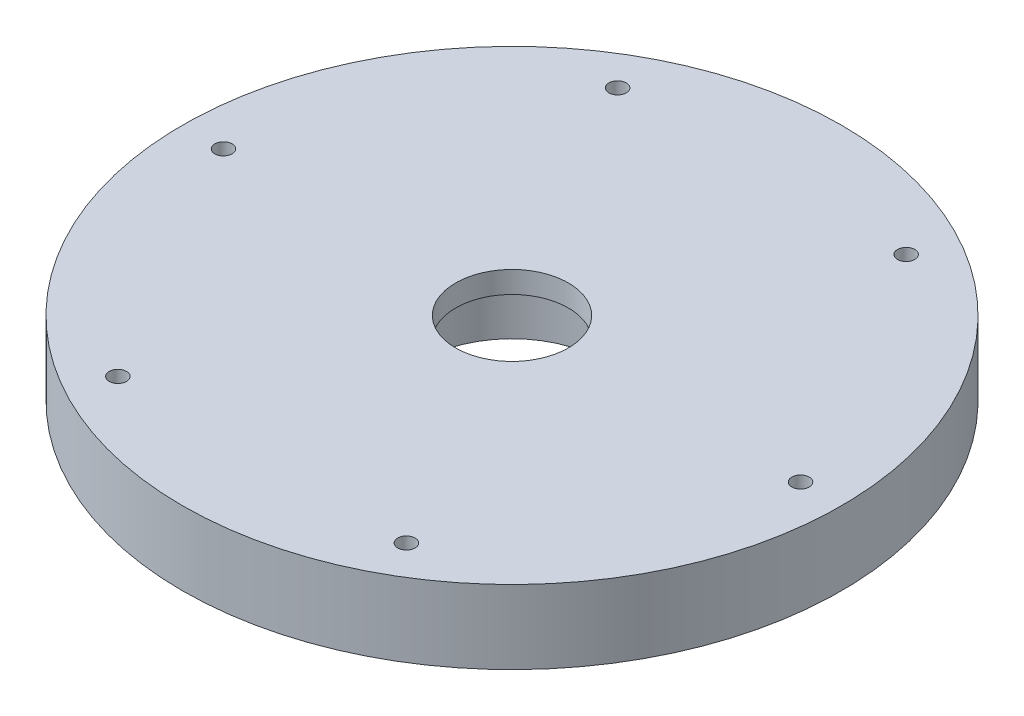
ISO-10303-21;
HEADER;
FILE_DESCRIPTION(('STEP AP214'),'2;1');
FILE_NAME('part.step','',(''),(''),'','','');
FILE_SCHEMA(('AUTOMOTIVE_DESIGN { 1 0 10303 214 1 1 1 1 }'));
ENDSEC;
DATA;
#1=APPLICATION_CONTEXT('core data for automotive mechanical design processes');
#2=APPLICATION_PROTOCOL_DEFINITION('international standard','automotive_design',2000,#1);
#3=PRODUCT_CONTEXT('',#1,'mechanical');
#4=PRODUCT('Part','Part','',(#3));
#5=PRODUCT_RELATED_PRODUCT_CATEGORY('part','',(#4));
#6=PRODUCT_DEFINITION_FORMATION('','',#4);
#7=PRODUCT_DEFINITION_CONTEXT('part definition',#1,'design');
#8=PRODUCT_DEFINITION('design','',#6,#7);
#9=PRODUCT_DEFINITION_SHAPE('','',#8);
#10=(LENGTH_UNIT() NAMED_UNIT(*) SI_UNIT(.MILLI.,.METRE.));
#11=(NAMED_UNIT(*) PLANE_ANGLE_UNIT() SI_UNIT($,.RADIAN.));
#12=(NAMED_UNIT(*) SI_UNIT($,.STERADIAN.) SOLID_ANGLE_UNIT());
#13=UNCERTAINTY_MEASURE_WITH_UNIT(LENGTH_MEASURE(1.E-05),#10,'distance_accuracy_value','');
#14=(GEOMETRIC_REPRESENTATION_CONTEXT(3) GLOBAL_UNCERTAINTY_ASSIGNED_CONTEXT((#13)) GLOBAL_UNIT_ASSIGNED_CONTEXT((#10,
#11,#12)) REPRESENTATION_CONTEXT('',''));
#15=CARTESIAN_POINT('',(0.,0.,0.));
#16=DIRECTION('',(0.,0.,1.));
#17=DIRECTION('',(1.,0.,0.));
#18=AXIS2_PLACEMENT_3D('',#15,#16,#17);
#19=CARTESIAN_POINT('',(0.,38.7086688188191,0.));
#20=DIRECTION('',(0.,1.,0.));
#21=DIRECTION('',(0.,0.,1.));
#22=AXIS2_PLACEMENT_3D('',#19,#20,#21);
#23=CYLINDRICAL_SURFACE('',#22,6.49999999999999);
#24=CARTESIAN_POINT('',(0.,0.,0.));
#25=DIRECTION('',(0.,1.,0.));
#26=DIRECTION('',(0.,0.,1.));
#27=AXIS2_PLACEMENT_3D('',#24,#25,#26);
#28=CIRCLE('',#27,6.49999999999999);
#29=CARTESIAN_POINT('',(0.,0.,6.49999999999999));
#30=VERTEX_POINT('',#29);
#31=EDGE_CURVE('E10',#30,#30,#28,.T.);
#32=ORIENTED_EDGE('',*,*,#31,.T.);
#33=EDGE_LOOP('',(#32));
#34=FACE_BOUND('',#33,.T.);
#35=CARTESIAN_POINT('',(0.,-2.5,0.));
#36=DIRECTION('',(0.,1.,0.));
#37=DIRECTION('',(0.,0.,1.));
#38=AXIS2_PLACEMENT_3D('',#35,#36,#37);
#39=CIRCLE('',#38,6.49999999999999);
#40=CARTESIAN_POINT('',(0.,-2.5,6.49999999999999));
#41=VERTEX_POINT('',#40);
#42=EDGE_CURVE('E62',#41,#41,#39,.T.);
#43=ORIENTED_EDGE('',*,*,#42,.F.);
#44=EDGE_LOOP('',(#43));
#45=FACE_BOUND('',#44,.T.);
#46=ADVANCED_FACE('F34',(#34,#45),#23,.F.);
#47=CARTESIAN_POINT('',(-6.49999999999999,0.,0.));
#48=DIRECTION('',(0.,1.,0.));
#49=DIRECTION('',(0.,0.,1.));
#50=AXIS2_PLACEMENT_3D('',#47,#48,#49);
#51=PLANE('',#50);
#52=CARTESIAN_POINT('',(-33.26875,0.,0.));
#53=DIRECTION('',(0.,-1.,0.));
#54=DIRECTION('',(0.,0.,-1.));
#55=AXIS2_PLACEMENT_3D('',#52,#53,#54);
#56=CIRCLE('',#55,0.999999999999998);
#57=CARTESIAN_POINT('',(-33.26875,0.,-0.999999999999992));
#58=VERTEX_POINT('',#57);
#59=EDGE_CURVE('E65',#58,#58,#56,.T.);
#60=ORIENTED_EDGE('',*,*,#59,.T.);
#61=EDGE_LOOP('',(#60));
#62=FACE_BOUND('',#61,.T.);
#63=CARTESIAN_POINT('',(-16.634375,0.,-28.8115826521536));
#64=DIRECTION('',(0.,-1.,0.));
#65=DIRECTION('',(0.,0.,-1.));
#66=AXIS2_PLACEMENT_3D('',#63,#64,#65);
#67=CIRCLE('',#66,0.999999999999998);
#68=CARTESIAN_POINT('',(-16.634375,0.,-29.8115826521536));
#69=VERTEX_POINT('',#68);
#70=EDGE_CURVE('E92',#69,#69,#67,.T.);
#71=ORIENTED_EDGE('',*,*,#70,.T.);
#72=EDGE_LOOP('',(#71));
#73=FACE_BOUND('',#72,.T.);
#74=CARTESIAN_POINT('',(16.634375,0.,-28.8115826521535));
#75=DIRECTION('',(0.,-1.,0.));
#76=DIRECTION('',(0.,0.,-1.));
#77=AXIS2_PLACEMENT_3D('',#74,#75,#76);
#78=CIRCLE('',#77,0.999999999999998);
#79=CARTESIAN_POINT('',(16.634375,0.,-29.8115826521535));
#80=VERTEX_POINT('',#79);
#81=EDGE_CURVE('E66',#80,#80,#78,.T.);
#82=ORIENTED_EDGE('',*,*,#81,.T.);
#83=EDGE_LOOP('',(#82));
#84=FACE_BOUND('',#83,.T.);
#85=CARTESIAN_POINT('',(33.26875,0.,0.));
#86=DIRECTION('',(0.,-1.,0.));
#87=DIRECTION('',(0.,0.,-1.));
#88=AXIS2_PLACEMENT_3D('',#85,#86,#87);
#89=CIRCLE('',#88,0.999999999999998);
#90=CARTESIAN_POINT('',(33.26875,0.,-1.));
#91=VERTEX_POINT('',#90);
#92=EDGE_CURVE('E73',#91,#91,#89,.T.);
#93=ORIENTED_EDGE('',*,*,#92,.T.);
#94=EDGE_LOOP('',(#93));
#95=FACE_BOUND('',#94,.T.);
#96=CARTESIAN_POINT('',(16.634375,0.,28.8115826521535));
#97=DIRECTION('',(0.,-1.,0.));
#98=DIRECTION('',(0.,0.,-1.));
#99=AXIS2_PLACEMENT_3D('',#96,#97,#98);
#100=CIRCLE('',#99,1.);
#101=CARTESIAN_POINT('',(16.634375,0.,27.8115826521535));
#102=VERTEX_POINT('',#101);
#103=EDGE_CURVE('E79',#102,#102,#100,.T.);
#104=ORIENTED_EDGE('',*,*,#103,.T.);
#105=EDGE_LOOP('',(#104));
#106=FACE_BOUND('',#105,.T.);
#107=CARTESIAN_POINT('',(-16.634375,0.,28.8115826521535));
#108=DIRECTION('',(0.,-1.,0.));
#109=DIRECTION('',(0.,0.,-1.));
#110=AXIS2_PLACEMENT_3D('',#107,#108,#109);
#111=CIRCLE('',#110,0.999999999999998);
#112=CARTESIAN_POINT('',(-16.634375,0.,27.8115826521535));
#113=VERTEX_POINT('',#112);
#114=EDGE_CURVE('E85',#113,#113,#111,.T.);
#115=ORIENTED_EDGE('',*,*,#114,.T.);
#116=EDGE_LOOP('',(#115));
#117=FACE_BOUND('',#116,.T.);
#118=CARTESIAN_POINT('',(0.,0.,0.));
#119=DIRECTION('',(0.,1.,0.));
#120=DIRECTION('',(0.,0.,1.));
#121=AXIS2_PLACEMENT_3D('',#118,#119,#120);
#122=CIRCLE('',#121,38.);
#123=CARTESIAN_POINT('',(0.,0.,38.));
#124=VERTEX_POINT('',#123);
#125=EDGE_CURVE('E40',#124,#124,#122,.T.);
#126=ORIENTED_EDGE('',*,*,#125,.T.);
#127=EDGE_LOOP('',(#126));
#128=FACE_BOUND('',#127,.T.);
#129=ORIENTED_EDGE('',*,*,#31,.F.);
#130=EDGE_LOOP('',(#129));
#131=FACE_BOUND('',#130,.T.);
#132=ADVANCED_FACE('F102',(#62,#73,#84,#95,#106,#117,#128,#131),#51,.T.);
#133=CARTESIAN_POINT('',(0.,38.7086688188191,0.));
#134=DIRECTION('',(0.,1.,0.));
#135=DIRECTION('',(0.,0.,1.));
#136=AXIS2_PLACEMENT_3D('',#133,#134,#135);
#137=CYLINDRICAL_SURFACE('',#136,38.);
#138=CARTESIAN_POINT('',(0.,-8.5,0.));
#139=DIRECTION('',(0.,1.,0.));
#140=DIRECTION('',(0.,0.,1.));
#141=AXIS2_PLACEMENT_3D('',#138,#139,#140);
#142=CIRCLE('',#141,38.);
#143=CARTESIAN_POINT('',(0.,-8.5,38.));
#144=VERTEX_POINT('',#143);
#145=EDGE_CURVE('E44',#144,#144,#142,.T.);
#146=ORIENTED_EDGE('',*,*,#145,.T.);
#147=EDGE_LOOP('',(#146));
#148=FACE_BOUND('',#147,.T.);
#149=ORIENTED_EDGE('',*,*,#125,.F.);
#150=EDGE_LOOP('',(#149));
#151=FACE_BOUND('',#150,.T.);
#152=ADVANCED_FACE('F140',(#148,#151),#137,.T.);
#153=CARTESIAN_POINT('',(-35.,-8.5,0.));
#154=DIRECTION('',(0.,-1.,0.));
#155=DIRECTION('',(0.,0.,-1.));
#156=AXIS2_PLACEMENT_3D('',#153,#154,#155);
#157=PLANE('',#156);
#158=CARTESIAN_POINT('',(0.,-8.5,0.));
#159=DIRECTION('',(0.,1.,0.));
#160=DIRECTION('',(0.,0.,1.));
#161=AXIS2_PLACEMENT_3D('',#158,#159,#160);
#162=CIRCLE('',#161,35.);
#163=CARTESIAN_POINT('',(0.,-8.5,35.));
#164=VERTEX_POINT('',#163);
#165=EDGE_CURVE('E48',#164,#164,#162,.T.);
#166=ORIENTED_EDGE('',*,*,#165,.T.);
#167=EDGE_LOOP('',(#166));
#168=FACE_BOUND('',#167,.T.);
#169=ORIENTED_EDGE('',*,*,#145,.F.);
#170=EDGE_LOOP('',(#169));
#171=FACE_BOUND('',#170,.T.);
#172=ADVANCED_FACE('F134',(#168,#171),#157,.T.);
#173=CARTESIAN_POINT('',(0.,38.7086688188191,0.));
#174=DIRECTION('',(0.,1.,0.));
#175=DIRECTION('',(0.,0.,1.));
#176=AXIS2_PLACEMENT_3D('',#173,#174,#175);
#177=CYLINDRICAL_SURFACE('',#176,35.);
#178=CARTESIAN_POINT('',(0.,-9.75,0.));
#179=DIRECTION('',(0.,1.,0.));
#180=DIRECTION('',(0.,0.,1.));
#181=AXIS2_PLACEMENT_3D('',#178,#179,#180);
#182=CIRCLE('',#181,35.);
#183=CARTESIAN_POINT('',(0.,-9.75,35.));
#184=VERTEX_POINT('',#183);
#185=EDGE_CURVE('E53',#184,#184,#182,.T.);
#186=ORIENTED_EDGE('',*,*,#185,.T.);
#187=EDGE_LOOP('',(#186));
#188=FACE_BOUND('',#187,.T.);
#189=ORIENTED_EDGE('',*,*,#165,.F.);
#190=EDGE_LOOP('',(#189));
#191=FACE_BOUND('',#190,.T.);
#192=ADVANCED_FACE('F116',(#188,#191),#177,.T.);
#193=CARTESIAN_POINT('',(-10.5,-9.75,0.));
#194=DIRECTION('',(0.,-1.,0.));
#195=DIRECTION('',(0.,0.,-1.));
#196=AXIS2_PLACEMENT_3D('',#193,#194,#195);
#197=PLANE('',#196);
#198=CARTESIAN_POINT('',(-33.26875,-9.75,0.));
#199=DIRECTION('',(0.,-1.,0.));
#200=DIRECTION('',(0.,0.,-1.));
#201=AXIS2_PLACEMENT_3D('',#198,#199,#200);
#202=CIRCLE('',#201,0.999999999999998);
#203=CARTESIAN_POINT('',(-33.26875,-9.75,-0.999999999999992));
#204=VERTEX_POINT('',#203);
#205=EDGE_CURVE('E91',#204,#204,#202,.T.);
#206=ORIENTED_EDGE('',*,*,#205,.F.);
#207=EDGE_LOOP('',(#206));
#208=FACE_BOUND('',#207,.T.);
#209=CARTESIAN_POINT('',(-16.634375,-9.75,-28.8115826521536));
#210=DIRECTION('',(0.,-1.,0.));
#211=DIRECTION('',(0.,0.,-1.));
#212=AXIS2_PLACEMENT_3D('',#209,#210,#211);
#213=CIRCLE('',#212,0.999999999999998);
#214=CARTESIAN_POINT('',(-16.634375,-9.75,-29.8115826521536));
#215=VERTEX_POINT('',#214);
#216=EDGE_CURVE('E70',#215,#215,#213,.T.);
#217=ORIENTED_EDGE('',*,*,#216,.F.);
#218=EDGE_LOOP('',(#217));
#219=FACE_BOUND('',#218,.T.);
#220=CARTESIAN_POINT('',(16.634375,-9.75,-28.8115826521535));
#221=DIRECTION('',(0.,-1.,0.));
#222=DIRECTION('',(0.,0.,-1.));
#223=AXIS2_PLACEMENT_3D('',#220,#221,#222);
#224=CIRCLE('',#223,0.999999999999998);
#225=CARTESIAN_POINT('',(16.634375,-9.75,-29.8115826521535));
#226=VERTEX_POINT('',#225);
#227=EDGE_CURVE('E69',#226,#226,#224,.T.);
#228=ORIENTED_EDGE('',*,*,#227,.F.);
#229=EDGE_LOOP('',(#228));
#230=FACE_BOUND('',#229,.T.);
#231=CARTESIAN_POINT('',(33.26875,-9.75,0.));
#232=DIRECTION('',(0.,-1.,0.));
#233=DIRECTION('',(0.,0.,-1.));
#234=AXIS2_PLACEMENT_3D('',#231,#232,#233);
#235=CIRCLE('',#234,0.999999999999998);
#236=CARTESIAN_POINT('',(33.26875,-9.75,-1.));
#237=VERTEX_POINT('',#236);
#238=EDGE_CURVE('E76',#237,#237,#235,.T.);
#239=ORIENTED_EDGE('',*,*,#238,.F.);
#240=EDGE_LOOP('',(#239));
#241=FACE_BOUND('',#240,.T.);
#242=CARTESIAN_POINT('',(16.634375,-9.75,28.8115826521535));
#243=DIRECTION('',(0.,-1.,0.));
#244=DIRECTION('',(0.,0.,-1.));
#245=AXIS2_PLACEMENT_3D('',#242,#243,#244);
#246=CIRCLE('',#245,1.);
#247=CARTESIAN_POINT('',(16.634375,-9.75,27.8115826521535));
#248=VERTEX_POINT('',#247);
#249=EDGE_CURVE('E82',#248,#248,#246,.T.);
#250=ORIENTED_EDGE('',*,*,#249,.F.);
#251=EDGE_LOOP('',(#250));
#252=FACE_BOUND('',#251,.T.);
#253=CARTESIAN_POINT('',(-16.634375,-9.75,28.8115826521535));
#254=DIRECTION('',(0.,-1.,0.));
#255=DIRECTION('',(0.,0.,-1.));
#256=AXIS2_PLACEMENT_3D('',#253,#254,#255);
#257=CIRCLE('',#256,0.999999999999998);
#258=CARTESIAN_POINT('',(-16.634375,-9.75,27.8115826521535));
#259=VERTEX_POINT('',#258);
#260=EDGE_CURVE('E88',#259,#259,#257,.T.);
#261=ORIENTED_EDGE('',*,*,#260,.F.);
#262=EDGE_LOOP('',(#261));
#263=FACE_BOUND('',#262,.T.);
#264=CARTESIAN_POINT('',(0.,-9.74999999999999,0.));
#265=DIRECTION('',(0.,1.,0.));
#266=DIRECTION('',(0.,0.,1.));
#267=AXIS2_PLACEMENT_3D('',#264,#265,#266);
#268=CIRCLE('',#267,10.5);
#269=CARTESIAN_POINT('',(0.,-9.74999999999999,10.5));
#270=VERTEX_POINT('',#269);
#271=EDGE_CURVE('E56',#270,#270,#268,.T.);
#272=ORIENTED_EDGE('',*,*,#271,.T.);
#273=EDGE_LOOP('',(#272));
#274=FACE_BOUND('',#273,.T.);
#275=ORIENTED_EDGE('',*,*,#185,.F.);
#276=EDGE_LOOP('',(#275));
#277=FACE_BOUND('',#276,.T.);
#278=ADVANCED_FACE('F112',(#208,#219,#230,#241,#252,#263,#274,#277),#197,.T.);
#279=CARTESIAN_POINT('',(0.,38.7086688188191,0.));
#280=DIRECTION('',(0.,1.,0.));
#281=DIRECTION('',(0.,0.,1.));
#282=AXIS2_PLACEMENT_3D('',#279,#280,#281);
#283=CYLINDRICAL_SURFACE('',#282,10.5);
#284=CARTESIAN_POINT('',(0.,-2.5,0.));
#285=DIRECTION('',(0.,1.,0.));
#286=DIRECTION('',(0.,0.,1.));
#287=AXIS2_PLACEMENT_3D('',#284,#285,#286);
#288=CIRCLE('',#287,10.5);
#289=CARTESIAN_POINT('',(0.,-2.5,10.5));
#290=VERTEX_POINT('',#289);
#291=EDGE_CURVE('E59',#290,#290,#288,.T.);
#292=ORIENTED_EDGE('',*,*,#291,.T.);
#293=EDGE_LOOP('',(#292));
#294=FACE_BOUND('',#293,.T.);
#295=ORIENTED_EDGE('',*,*,#271,.F.);
#296=EDGE_LOOP('',(#295));
#297=FACE_BOUND('',#296,.T.);
#298=ADVANCED_FACE('F115',(#294,#297),#283,.F.);
#299=CARTESIAN_POINT('',(-10.5,-2.5,0.));
#300=DIRECTION('',(0.,-1.,0.));
#301=DIRECTION('',(0.,0.,-1.));
#302=AXIS2_PLACEMENT_3D('',#299,#300,#301);
#303=PLANE('',#302);
#304=ORIENTED_EDGE('',*,*,#42,.T.);
#305=EDGE_LOOP('',(#304));
#306=FACE_BOUND('',#305,.T.);
#307=ORIENTED_EDGE('',*,*,#291,.F.);
#308=EDGE_LOOP('',(#307));
#309=FACE_BOUND('',#308,.T.);
#310=ADVANCED_FACE('F156',(#306,#309),#303,.T.);
#311=CARTESIAN_POINT('',(-16.634375,0.,28.8115826521535));
#312=DIRECTION('',(0.,-1.,0.));
#313=DIRECTION('',(0.,0.,-1.));
#314=AXIS2_PLACEMENT_3D('',#311,#312,#313);
#315=CYLINDRICAL_SURFACE('',#314,0.999999999999998);
#316=ORIENTED_EDGE('',*,*,#114,.F.);
#317=EDGE_LOOP('',(#316));
#318=FACE_BOUND('',#317,.T.);
#319=ORIENTED_EDGE('',*,*,#260,.T.);
#320=EDGE_LOOP('',(#319));
#321=FACE_BOUND('',#320,.T.);
#322=ADVANCED_FACE('F159',(#318,#321),#315,.F.);
#323=CARTESIAN_POINT('',(16.634375,0.,28.8115826521535));
#324=DIRECTION('',(0.,-1.,0.));
#325=DIRECTION('',(0.,0.,-1.));
#326=AXIS2_PLACEMENT_3D('',#323,#324,#325);
#327=CYLINDRICAL_SURFACE('',#326,1.);
#328=ORIENTED_EDGE('',*,*,#103,.F.);
#329=EDGE_LOOP('',(#328));
#330=FACE_BOUND('',#329,.T.);
#331=ORIENTED_EDGE('',*,*,#249,.T.);
#332=EDGE_LOOP('',(#331));
#333=FACE_BOUND('',#332,.T.);
#334=ADVANCED_FACE('F176',(#330,#333),#327,.F.);
#335=CARTESIAN_POINT('',(33.26875,0.,0.));
#336=DIRECTION('',(0.,-1.,0.));
#337=DIRECTION('',(0.,0.,-1.));
#338=AXIS2_PLACEMENT_3D('',#335,#336,#337);
#339=CYLINDRICAL_SURFACE('',#338,0.999999999999998);
#340=ORIENTED_EDGE('',*,*,#92,.F.);
#341=EDGE_LOOP('',(#340));
#342=FACE_BOUND('',#341,.T.);
#343=ORIENTED_EDGE('',*,*,#238,.T.);
#344=EDGE_LOOP('',(#343));
#345=FACE_BOUND('',#344,.T.);
#346=ADVANCED_FACE('F172',(#342,#345),#339,.F.);
#347=CARTESIAN_POINT('',(16.634375,0.,-28.8115826521535));
#348=DIRECTION('',(0.,-1.,0.));
#349=DIRECTION('',(0.,0.,-1.));
#350=AXIS2_PLACEMENT_3D('',#347,#348,#349);
#351=CYLINDRICAL_SURFACE('',#350,0.999999999999998);
#352=ORIENTED_EDGE('',*,*,#81,.F.);
#353=EDGE_LOOP('',(#352));
#354=FACE_BOUND('',#353,.T.);
#355=ORIENTED_EDGE('',*,*,#227,.T.);
#356=EDGE_LOOP('',(#355));
#357=FACE_BOUND('',#356,.T.);
#358=ADVANCED_FACE('F169',(#354,#357),#351,.F.);
#359=CARTESIAN_POINT('',(-16.634375,0.,-28.8115826521536));
#360=DIRECTION('',(0.,-1.,0.));
#361=DIRECTION('',(0.,0.,-1.));
#362=AXIS2_PLACEMENT_3D('',#359,#360,#361);
#363=CYLINDRICAL_SURFACE('',#362,0.999999999999998);
#364=ORIENTED_EDGE('',*,*,#70,.F.);
#365=EDGE_LOOP('',(#364));
#366=FACE_BOUND('',#365,.T.);
#367=ORIENTED_EDGE('',*,*,#216,.T.);
#368=EDGE_LOOP('',(#367));
#369=FACE_BOUND('',#368,.T.);
#370=ADVANCED_FACE('F108',(#366,#369),#363,.F.);
#371=CARTESIAN_POINT('',(-33.26875,0.,0.));
#372=DIRECTION('',(0.,-1.,0.));
#373=DIRECTION('',(0.,0.,-1.));
#374=AXIS2_PLACEMENT_3D('',#371,#372,#373);
#375=CYLINDRICAL_SURFACE('',#374,0.999999999999998);
#376=ORIENTED_EDGE('',*,*,#59,.F.);
#377=EDGE_LOOP('',(#376));
#378=FACE_BOUND('',#377,.T.);
#379=ORIENTED_EDGE('',*,*,#205,.T.);
#380=EDGE_LOOP('',(#379));
#381=FACE_BOUND('',#380,.T.);
#382=ADVANCED_FACE('F105',(#378,#381),#375,.F.);
#383=CLOSED_SHELL('',(#46,#132,#152,#172,#192,#278,#298,#310,#322,#334,#346,#358,#370,#382));
#384=MANIFOLD_SOLID_BREP('B2',#383);
#385=ADVANCED_BREP_SHAPE_REPRESENTATION('',(#18,#384),#14);
#386=SHAPE_DEFINITION_REPRESENTATION(#9,#385);
ENDSEC;
END-ISO-10303-21;
